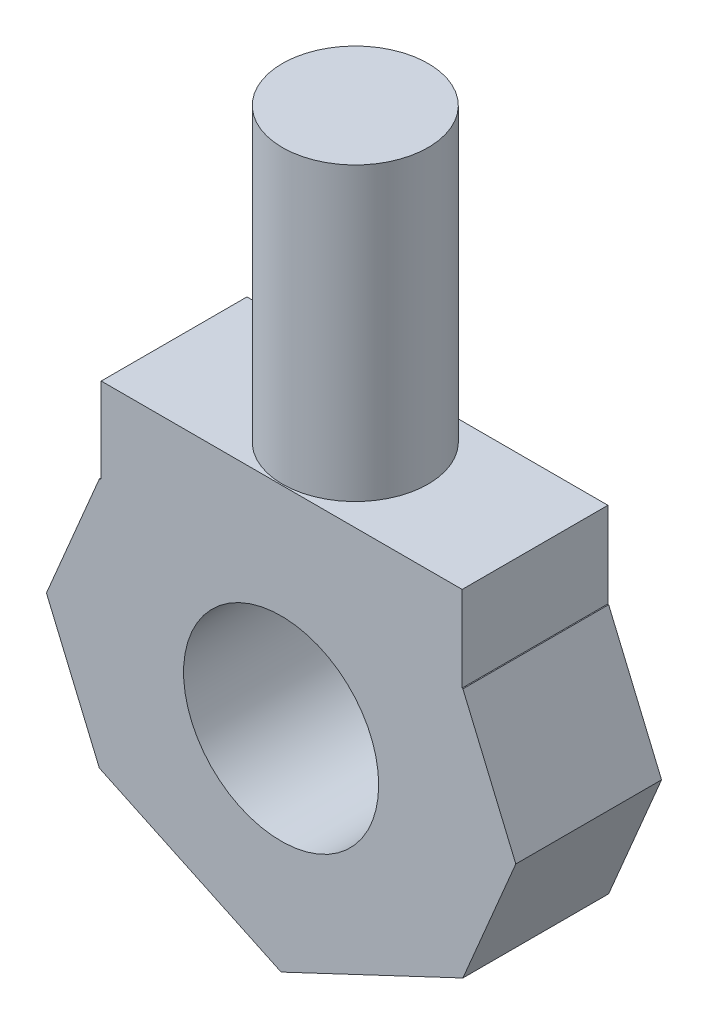
ISO-10303-21;
HEADER;
FILE_DESCRIPTION(('STEP AP214'),'2;1');
FILE_NAME('part.step','',(''),(''),'','','');
FILE_SCHEMA(('AUTOMOTIVE_DESIGN { 1 0 10303 214 1 1 1 1 }'));
ENDSEC;
DATA;
#1=APPLICATION_CONTEXT('core data for automotive mechanical design processes');
#2=APPLICATION_PROTOCOL_DEFINITION('international standard','automotive_design',2000,#1);
#3=PRODUCT_CONTEXT('',#1,'mechanical');
#4=PRODUCT('Part','Part','',(#3));
#5=PRODUCT_RELATED_PRODUCT_CATEGORY('part','',(#4));
#6=PRODUCT_DEFINITION_FORMATION('','',#4);
#7=PRODUCT_DEFINITION_CONTEXT('part definition',#1,'design');
#8=PRODUCT_DEFINITION('design','',#6,#7);
#9=PRODUCT_DEFINITION_SHAPE('','',#8);
#10=(LENGTH_UNIT() NAMED_UNIT(*) SI_UNIT(.MILLI.,.METRE.));
#11=(NAMED_UNIT(*) PLANE_ANGLE_UNIT() SI_UNIT($,.RADIAN.));
#12=(NAMED_UNIT(*) SI_UNIT($,.STERADIAN.) SOLID_ANGLE_UNIT());
#13=UNCERTAINTY_MEASURE_WITH_UNIT(LENGTH_MEASURE(1.E-05),#10,'distance_accuracy_value','');
#14=(GEOMETRIC_REPRESENTATION_CONTEXT(3) GLOBAL_UNCERTAINTY_ASSIGNED_CONTEXT((#13)) GLOBAL_UNIT_ASSIGNED_CONTEXT((#10,
#11,#12)) REPRESENTATION_CONTEXT('',''));
#15=CARTESIAN_POINT('',(0.,0.,0.));
#16=DIRECTION('',(0.,0.,1.));
#17=DIRECTION('',(1.,0.,0.));
#18=AXIS2_PLACEMENT_3D('',#15,#16,#17);
#19=CARTESIAN_POINT('',(0.,0.,10.));
#20=DIRECTION('',(0.,0.,1.));
#21=DIRECTION('',(1.,0.,0.));
#22=AXIS2_PLACEMENT_3D('',#19,#20,#21);
#23=PLANE('',#22);
#24=DIRECTION('',(-0.904410092976755,0.426664251750458,0.));
#25=VECTOR('',#24,1.);
#26=CARTESIAN_POINT('',(12.4716293470518,-5.88361236212527,10.));
#27=LINE('',#26,#25);
#28=CARTESIAN_POINT('',(12.4716293470518,-5.88361236212527,10.));
#29=VERTEX_POINT('',#28);
#30=CARTESIAN_POINT('',(12.4220102858015,-5.86020408770936,10.));
#31=VERTEX_POINT('',#30);
#32=EDGE_CURVE('E186',#29,#31,#27,.T.);
#33=ORIENTED_EDGE('',*,*,#32,.T.);
#34=DIRECTION('',(0.,1.,0.));
#35=VECTOR('',#34,1.);
#36=CARTESIAN_POINT('',(12.4220102858015,-7.,10.));
#37=LINE('',#36,#35);
#38=CARTESIAN_POINT('',(12.4220102858015,0.,10.));
#39=VERTEX_POINT('',#38);
#40=EDGE_CURVE('E172',#31,#39,#37,.T.);
#41=ORIENTED_EDGE('',*,*,#40,.T.);
#42=DIRECTION('',(1.,0.,0.));
#43=VECTOR('',#42,1.);
#44=CARTESIAN_POINT('',(-12.3435018685871,0.,10.));
#45=LINE('',#44,#43);
#46=CARTESIAN_POINT('',(-12.3435018685871,0.,10.));
#47=VERTEX_POINT('',#46);
#48=EDGE_CURVE('E160',#47,#39,#45,.T.);
#49=ORIENTED_EDGE('',*,*,#48,.F.);
#50=DIRECTION('',(0.,1.,0.));
#51=VECTOR('',#50,1.);
#52=CARTESIAN_POINT('',(-12.3435018685871,-7.,10.));
#53=LINE('',#52,#51);
#54=CARTESIAN_POINT('',(-12.3435018685871,-5.82316697882812,10.));
#55=VERTEX_POINT('',#54);
#56=EDGE_CURVE('E63',#55,#47,#53,.T.);
#57=ORIENTED_EDGE('',*,*,#56,.F.);
#58=DIRECTION('',(-0.904410092976755,-0.426664251750458,0.));
#59=VECTOR('',#58,1.);
#60=CARTESIAN_POINT('',(-12.4716293470518,-5.88361236212527,10.));
#61=LINE('',#60,#59);
#62=CARTESIAN_POINT('',(-12.4716293470518,-5.88361236212527,10.));
#63=VERTEX_POINT('',#62);
#64=EDGE_CURVE('E190',#55,#63,#61,.T.);
#65=ORIENTED_EDGE('',*,*,#64,.T.);
#66=DIRECTION('',(-0.389297249276253,-0.92111218193331,0.));
#67=VECTOR('',#66,1.);
#68=CARTESIAN_POINT('',(-12.4716293470518,-5.88361236212527,10.));
#69=LINE('',#68,#67);
#70=CARTESIAN_POINT('',(-16.1022581048738,-14.4740053924498,10.));
#71=VERTEX_POINT('',#70);
#72=EDGE_CURVE('E194',#63,#71,#69,.T.);
#73=ORIENTED_EDGE('',*,*,#72,.T.);
#74=DIRECTION('',(0.389297249276253,-0.92111218193331,0.));
#75=VECTOR('',#74,1.);
#76=CARTESIAN_POINT('',(-12.4716293470518,-23.0643984227743,10.));
#77=LINE('',#76,#75);
#78=CARTESIAN_POINT('',(-12.4716293470518,-23.0643984227743,10.));
#79=VERTEX_POINT('',#78);
#80=EDGE_CURVE('E197',#71,#79,#77,.T.);
#81=ORIENTED_EDGE('',*,*,#80,.T.);
#82=DIRECTION('',(0.904410092976755,-0.426664251750458,0.));
#83=VECTOR('',#82,1.);
#84=CARTESIAN_POINT('',(-12.4716293470518,-23.0643984227743,10.));
#85=LINE('',#84,#83);
#86=CARTESIAN_POINT('',(0.,-28.9480107848996,10.));
#87=VERTEX_POINT('',#86);
#88=EDGE_CURVE('E200',#79,#87,#85,.T.);
#89=ORIENTED_EDGE('',*,*,#88,.T.);
#90=DIRECTION('',(0.904410092976755,0.426664251750458,0.));
#91=VECTOR('',#90,1.);
#92=CARTESIAN_POINT('',(12.4716293470518,-23.0643984227743,10.));
#93=LINE('',#92,#91);
#94=CARTESIAN_POINT('',(12.4716293470518,-23.0643984227743,10.));
#95=VERTEX_POINT('',#94);
#96=EDGE_CURVE('E203',#87,#95,#93,.T.);
#97=ORIENTED_EDGE('',*,*,#96,.T.);
#98=DIRECTION('',(0.389297249276253,0.92111218193331,0.));
#99=VECTOR('',#98,1.);
#100=CARTESIAN_POINT('',(12.4716293470518,-23.0643984227743,10.));
#101=LINE('',#100,#99);
#102=CARTESIAN_POINT('',(16.1022581048738,-14.4740053924498,10.));
#103=VERTEX_POINT('',#102);
#104=EDGE_CURVE('E206',#95,#103,#101,.T.);
#105=ORIENTED_EDGE('',*,*,#104,.T.);
#106=DIRECTION('',(-0.389297249276253,0.92111218193331,0.));
#107=VECTOR('',#106,1.);
#108=CARTESIAN_POINT('',(12.4716293470518,-5.88361236212527,10.));
#109=LINE('',#108,#107);
#110=EDGE_CURVE('E209',#103,#29,#109,.T.);
#111=ORIENTED_EDGE('',*,*,#110,.T.);
#112=EDGE_LOOP('',(#33,#41,#49,#57,#65,#73,#81,#89,#97,#105,#111));
#113=FACE_BOUND('',#112,.T.);
#114=CARTESIAN_POINT('',(0.,-14.4740053924498,10.));
#115=DIRECTION('',(0.,0.,1.));
#116=DIRECTION('',(1.,0.,0.));
#117=AXIS2_PLACEMENT_3D('',#114,#115,#116);
#118=CIRCLE('',#117,6.69445656520258);
#119=CARTESIAN_POINT('',(6.69445656520258,-14.4740053924498,10.));
#120=VERTEX_POINT('',#119);
#121=EDGE_CURVE('E178',#120,#120,#118,.T.);
#122=ORIENTED_EDGE('',*,*,#121,.F.);
#123=EDGE_LOOP('',(#122));
#124=FACE_BOUND('',#123,.T.);
#125=ADVANCED_FACE('F39',(#113,#124),#23,.T.);
#126=CARTESIAN_POINT('',(0.,0.,0.));
#127=DIRECTION('',(0.,0.,1.));
#128=DIRECTION('',(1.,0.,0.));
#129=AXIS2_PLACEMENT_3D('',#126,#127,#128);
#130=PLANE('',#129);
#131=DIRECTION('',(0.,1.,0.));
#132=VECTOR('',#131,1.);
#133=CARTESIAN_POINT('',(12.4220102858015,-7.,0.));
#134=LINE('',#133,#132);
#135=CARTESIAN_POINT('',(12.4220102858015,-5.86020408770936,0.));
#136=VERTEX_POINT('',#135);
#137=CARTESIAN_POINT('',(12.4220102858015,0.,0.));
#138=VERTEX_POINT('',#137);
#139=EDGE_CURVE('E169',#136,#138,#134,.T.);
#140=ORIENTED_EDGE('',*,*,#139,.F.);
#141=DIRECTION('',(-0.904410092976755,0.426664251750458,0.));
#142=VECTOR('',#141,1.);
#143=CARTESIAN_POINT('',(12.4716293470518,-5.88361236212527,0.));
#144=LINE('',#143,#142);
#145=CARTESIAN_POINT('',(12.4716293470518,-5.88361236212527,0.));
#146=VERTEX_POINT('',#145);
#147=EDGE_CURVE('E182',#146,#136,#144,.T.);
#148=ORIENTED_EDGE('',*,*,#147,.F.);
#149=DIRECTION('',(-0.389297249276253,0.92111218193331,0.));
#150=VECTOR('',#149,1.);
#151=CARTESIAN_POINT('',(12.4716293470518,-5.88361236212527,0.));
#152=LINE('',#151,#150);
#153=CARTESIAN_POINT('',(16.1022581048738,-14.4740053924498,0.));
#154=VERTEX_POINT('',#153);
#155=EDGE_CURVE('E191',#154,#146,#152,.T.);
#156=ORIENTED_EDGE('',*,*,#155,.F.);
#157=DIRECTION('',(0.389297249276253,0.92111218193331,0.));
#158=VECTOR('',#157,1.);
#159=CARTESIAN_POINT('',(12.4716293470518,-23.0643984227743,0.));
#160=LINE('',#159,#158);
#161=CARTESIAN_POINT('',(12.4716293470518,-23.0643984227743,0.));
#162=VERTEX_POINT('',#161);
#163=EDGE_CURVE('E231',#162,#154,#160,.T.);
#164=ORIENTED_EDGE('',*,*,#163,.F.);
#165=DIRECTION('',(0.904410092976755,0.426664251750458,0.));
#166=VECTOR('',#165,1.);
#167=CARTESIAN_POINT('',(12.4716293470518,-23.0643984227743,0.));
#168=LINE('',#167,#166);
#169=CARTESIAN_POINT('',(0.,-28.9480107848996,0.));
#170=VERTEX_POINT('',#169);
#171=EDGE_CURVE('E228',#170,#162,#168,.T.);
#172=ORIENTED_EDGE('',*,*,#171,.F.);
#173=DIRECTION('',(0.904410092976755,-0.426664251750458,0.));
#174=VECTOR('',#173,1.);
#175=CARTESIAN_POINT('',(-12.4716293470518,-23.0643984227743,0.));
#176=LINE('',#175,#174);
#177=CARTESIAN_POINT('',(-12.4716293470518,-23.0643984227743,0.));
#178=VERTEX_POINT('',#177);
#179=EDGE_CURVE('E225',#178,#170,#176,.T.);
#180=ORIENTED_EDGE('',*,*,#179,.F.);
#181=DIRECTION('',(0.389297249276253,-0.92111218193331,0.));
#182=VECTOR('',#181,1.);
#183=CARTESIAN_POINT('',(-12.4716293470518,-23.0643984227743,0.));
#184=LINE('',#183,#182);
#185=CARTESIAN_POINT('',(-16.1022581048738,-14.4740053924498,0.));
#186=VERTEX_POINT('',#185);
#187=EDGE_CURVE('E222',#186,#178,#184,.T.);
#188=ORIENTED_EDGE('',*,*,#187,.F.);
#189=DIRECTION('',(-0.389297249276253,-0.92111218193331,0.));
#190=VECTOR('',#189,1.);
#191=CARTESIAN_POINT('',(-12.4716293470518,-5.88361236212527,0.));
#192=LINE('',#191,#190);
#193=CARTESIAN_POINT('',(-12.4716293470518,-5.88361236212527,0.));
#194=VERTEX_POINT('',#193);
#195=EDGE_CURVE('E219',#194,#186,#192,.T.);
#196=ORIENTED_EDGE('',*,*,#195,.F.);
#197=DIRECTION('',(-0.904410092976755,-0.426664251750458,0.));
#198=VECTOR('',#197,1.);
#199=CARTESIAN_POINT('',(-12.4716293470518,-5.88361236212527,0.));
#200=LINE('',#199,#198);
#201=CARTESIAN_POINT('',(-12.3435018685871,-5.82316697882812,0.));
#202=VERTEX_POINT('',#201);
#203=EDGE_CURVE('E216',#202,#194,#200,.T.);
#204=ORIENTED_EDGE('',*,*,#203,.F.);
#205=DIRECTION('',(0.,1.,0.));
#206=VECTOR('',#205,1.);
#207=CARTESIAN_POINT('',(-12.3435018685871,-7.,0.));
#208=LINE('',#207,#206);
#209=CARTESIAN_POINT('',(-12.3435018685871,0.,0.));
#210=VERTEX_POINT('',#209);
#211=EDGE_CURVE('E165',#202,#210,#208,.T.);
#212=ORIENTED_EDGE('',*,*,#211,.T.);
#213=DIRECTION('',(-1.,0.,0.));
#214=VECTOR('',#213,1.);
#215=CARTESIAN_POINT('',(-12.3435018685871,0.,0.));
#216=LINE('',#215,#214);
#217=CARTESIAN_POINT('',(-0.930466410144817,0.,0.));
#218=VERTEX_POINT('',#217);
#219=EDGE_CURVE('E138',#218,#210,#216,.T.);
#220=ORIENTED_EDGE('',*,*,#219,.F.);
#221=CARTESIAN_POINT('',(0.930466410144817,0.,0.));
#222=VERTEX_POINT('',#221);
#223=EDGE_CURVE('E136',#222,#218,#216,.T.);
#224=ORIENTED_EDGE('',*,*,#223,.F.);
#225=EDGE_CURVE('E127',#138,#222,#216,.T.);
#226=ORIENTED_EDGE('',*,*,#225,.F.);
#227=EDGE_LOOP('',(#140,#148,#156,#164,#172,#180,#188,#196,#204,#212,#220,#224,#226));
#228=FACE_BOUND('',#227,.T.);
#229=CARTESIAN_POINT('',(0.,-14.4740053924498,0.));
#230=DIRECTION('',(0.,0.,1.));
#231=DIRECTION('',(1.,0.,0.));
#232=AXIS2_PLACEMENT_3D('',#229,#230,#231);
#233=CIRCLE('',#232,6.69445656520258);
#234=CARTESIAN_POINT('',(6.69445656520258,-14.4740053924498,0.));
#235=VERTEX_POINT('',#234);
#236=EDGE_CURVE('E168',#235,#235,#233,.T.);
#237=ORIENTED_EDGE('',*,*,#236,.T.);
#238=EDGE_LOOP('',(#237));
#239=FACE_BOUND('',#238,.T.);
#240=ADVANCED_FACE('F140',(#228,#239),#130,.F.);
#241=CARTESIAN_POINT('',(12.4716293470518,-5.88361236212527,10.));
#242=DIRECTION('',(-0.426664251750458,-0.904410092976755,0.));
#243=DIRECTION('',(0.904410092976755,-0.426664251750458,0.));
#244=AXIS2_PLACEMENT_3D('',#241,#242,#243);
#245=PLANE('',#244);
#246=ORIENTED_EDGE('',*,*,#147,.T.);
#247=DIRECTION('',(0.,0.,1.));
#248=VECTOR('',#247,1.);
#249=CARTESIAN_POINT('',(12.4220102858015,-5.86020408770936,10.));
#250=LINE('',#249,#248);
#251=EDGE_CURVE('E43',#136,#31,#250,.T.);
#252=ORIENTED_EDGE('',*,*,#251,.T.);
#253=ORIENTED_EDGE('',*,*,#32,.F.);
#254=DIRECTION('',(0.,0.,-1.));
#255=VECTOR('',#254,1.);
#256=CARTESIAN_POINT('',(12.4716293470518,-5.88361236212527,10.));
#257=LINE('',#256,#255);
#258=EDGE_CURVE('E212',#29,#146,#257,.T.);
#259=ORIENTED_EDGE('',*,*,#258,.T.);
#260=EDGE_LOOP('',(#246,#252,#253,#259));
#261=FACE_BOUND('',#260,.T.);
#262=ADVANCED_FACE('F41',(#261),#245,.F.);
#263=CARTESIAN_POINT('',(-12.4716293470518,-5.88361236212527,10.));
#264=DIRECTION('',(0.426664251750458,-0.904410092976755,0.));
#265=DIRECTION('',(0.904410092976755,0.426664251750458,0.));
#266=AXIS2_PLACEMENT_3D('',#263,#264,#265);
#267=PLANE('',#266);
#268=ORIENTED_EDGE('',*,*,#64,.F.);
#269=DIRECTION('',(0.,0.,-1.));
#270=VECTOR('',#269,1.);
#271=CARTESIAN_POINT('',(-12.3435018685871,-5.82316697882812,10.));
#272=LINE('',#271,#270);
#273=EDGE_CURVE('E262',#55,#202,#272,.T.);
#274=ORIENTED_EDGE('',*,*,#273,.T.);
#275=ORIENTED_EDGE('',*,*,#203,.T.);
#276=DIRECTION('',(0.,0.,-1.));
#277=VECTOR('',#276,1.);
#278=CARTESIAN_POINT('',(-12.4716293470518,-5.88361236212527,10.));
#279=LINE('',#278,#277);
#280=EDGE_CURVE('E259',#63,#194,#279,.T.);
#281=ORIENTED_EDGE('',*,*,#280,.F.);
#282=EDGE_LOOP('',(#268,#274,#275,#281));
#283=FACE_BOUND('',#282,.T.);
#284=ADVANCED_FACE('F324',(#283),#267,.F.);
#285=CARTESIAN_POINT('',(-12.4716293470518,-5.88361236212527,10.));
#286=DIRECTION('',(0.92111218193331,-0.389297249276253,0.));
#287=DIRECTION('',(0.389297249276253,0.92111218193331,0.));
#288=AXIS2_PLACEMENT_3D('',#285,#286,#287);
#289=PLANE('',#288);
#290=ORIENTED_EDGE('',*,*,#195,.T.);
#291=DIRECTION('',(0.,0.,-1.));
#292=VECTOR('',#291,1.);
#293=CARTESIAN_POINT('',(-16.1022581048738,-14.4740053924498,10.));
#294=LINE('',#293,#292);
#295=EDGE_CURVE('E255',#71,#186,#294,.T.);
#296=ORIENTED_EDGE('',*,*,#295,.F.);
#297=ORIENTED_EDGE('',*,*,#72,.F.);
#298=ORIENTED_EDGE('',*,*,#280,.T.);
#299=EDGE_LOOP('',(#290,#296,#297,#298));
#300=FACE_BOUND('',#299,.T.);
#301=ADVANCED_FACE('F321',(#300),#289,.F.);
#302=CARTESIAN_POINT('',(-12.4716293470518,-23.0643984227743,10.));
#303=DIRECTION('',(0.92111218193331,0.389297249276253,0.));
#304=DIRECTION('',(-0.389297249276253,0.92111218193331,0.));
#305=AXIS2_PLACEMENT_3D('',#302,#303,#304);
#306=PLANE('',#305);
#307=ORIENTED_EDGE('',*,*,#187,.T.);
#308=DIRECTION('',(0.,0.,-1.));
#309=VECTOR('',#308,1.);
#310=CARTESIAN_POINT('',(-12.4716293470518,-23.0643984227743,10.));
#311=LINE('',#310,#309);
#312=EDGE_CURVE('E251',#79,#178,#311,.T.);
#313=ORIENTED_EDGE('',*,*,#312,.F.);
#314=ORIENTED_EDGE('',*,*,#80,.F.);
#315=ORIENTED_EDGE('',*,*,#295,.T.);
#316=EDGE_LOOP('',(#307,#313,#314,#315));
#317=FACE_BOUND('',#316,.T.);
#318=ADVANCED_FACE('F317',(#317),#306,.F.);
#319=CARTESIAN_POINT('',(-12.4716293470518,-23.0643984227743,10.));
#320=DIRECTION('',(0.426664251750458,0.904410092976755,0.));
#321=DIRECTION('',(-0.904410092976755,0.426664251750458,0.));
#322=AXIS2_PLACEMENT_3D('',#319,#320,#321);
#323=PLANE('',#322);
#324=ORIENTED_EDGE('',*,*,#179,.T.);
#325=DIRECTION('',(0.,0.,-1.));
#326=VECTOR('',#325,1.);
#327=CARTESIAN_POINT('',(0.,-28.9480107848996,10.));
#328=LINE('',#327,#326);
#329=EDGE_CURVE('E247',#87,#170,#328,.T.);
#330=ORIENTED_EDGE('',*,*,#329,.F.);
#331=ORIENTED_EDGE('',*,*,#88,.F.);
#332=ORIENTED_EDGE('',*,*,#312,.T.);
#333=EDGE_LOOP('',(#324,#330,#331,#332));
#334=FACE_BOUND('',#333,.T.);
#335=ADVANCED_FACE('F313',(#334),#323,.F.);
#336=CARTESIAN_POINT('',(12.4716293470518,-23.0643984227743,10.));
#337=DIRECTION('',(-0.426664251750458,0.904410092976755,0.));
#338=DIRECTION('',(-0.904410092976755,-0.426664251750458,0.));
#339=AXIS2_PLACEMENT_3D('',#336,#337,#338);
#340=PLANE('',#339);
#341=ORIENTED_EDGE('',*,*,#171,.T.);
#342=DIRECTION('',(0.,0.,-1.));
#343=VECTOR('',#342,1.);
#344=CARTESIAN_POINT('',(12.4716293470518,-23.0643984227743,10.));
#345=LINE('',#344,#343);
#346=EDGE_CURVE('E243',#95,#162,#345,.T.);
#347=ORIENTED_EDGE('',*,*,#346,.F.);
#348=ORIENTED_EDGE('',*,*,#96,.F.);
#349=ORIENTED_EDGE('',*,*,#329,.T.);
#350=EDGE_LOOP('',(#341,#347,#348,#349));
#351=FACE_BOUND('',#350,.T.);
#352=ADVANCED_FACE('F309',(#351),#340,.F.);
#353=CARTESIAN_POINT('',(12.4716293470518,-23.0643984227743,10.));
#354=DIRECTION('',(-0.92111218193331,0.389297249276253,0.));
#355=DIRECTION('',(-0.389297249276253,-0.92111218193331,0.));
#356=AXIS2_PLACEMENT_3D('',#353,#354,#355);
#357=PLANE('',#356);
#358=ORIENTED_EDGE('',*,*,#163,.T.);
#359=DIRECTION('',(0.,0.,-1.));
#360=VECTOR('',#359,1.);
#361=CARTESIAN_POINT('',(16.1022581048738,-14.4740053924498,10.));
#362=LINE('',#361,#360);
#363=EDGE_CURVE('E239',#103,#154,#362,.T.);
#364=ORIENTED_EDGE('',*,*,#363,.F.);
#365=ORIENTED_EDGE('',*,*,#104,.F.);
#366=ORIENTED_EDGE('',*,*,#346,.T.);
#367=EDGE_LOOP('',(#358,#364,#365,#366));
#368=FACE_BOUND('',#367,.T.);
#369=ADVANCED_FACE('F306',(#368),#357,.F.);
#370=CARTESIAN_POINT('',(12.4716293470518,-5.88361236212527,10.));
#371=DIRECTION('',(-0.92111218193331,-0.389297249276253,0.));
#372=DIRECTION('',(0.389297249276253,-0.92111218193331,0.));
#373=AXIS2_PLACEMENT_3D('',#370,#371,#372);
#374=PLANE('',#373);
#375=ORIENTED_EDGE('',*,*,#155,.T.);
#376=ORIENTED_EDGE('',*,*,#258,.F.);
#377=ORIENTED_EDGE('',*,*,#110,.F.);
#378=ORIENTED_EDGE('',*,*,#363,.T.);
#379=EDGE_LOOP('',(#375,#376,#377,#378));
#380=FACE_BOUND('',#379,.T.);
#381=ADVANCED_FACE('F280',(#380),#374,.F.);
#382=CARTESIAN_POINT('',(0.,-14.4740053924498,10.));
#383=DIRECTION('',(0.,0.,-1.));
#384=DIRECTION('',(-1.,0.,0.));
#385=AXIS2_PLACEMENT_3D('',#382,#383,#384);
#386=CYLINDRICAL_SURFACE('',#385,6.69445656520258);
#387=ORIENTED_EDGE('',*,*,#121,.T.);
#388=EDGE_LOOP('',(#387));
#389=FACE_BOUND('',#388,.T.);
#390=ORIENTED_EDGE('',*,*,#236,.F.);
#391=EDGE_LOOP('',(#390));
#392=FACE_BOUND('',#391,.T.);
#393=ADVANCED_FACE('F286',(#389,#392),#386,.F.);
#394=CARTESIAN_POINT('',(12.4220102858015,-7.,0.));
#395=DIRECTION('',(1.,0.,0.));
#396=DIRECTION('',(0.,0.,-1.));
#397=AXIS2_PLACEMENT_3D('',#394,#395,#396);
#398=PLANE('',#397);
#399=ORIENTED_EDGE('',*,*,#251,.F.);
#400=ORIENTED_EDGE('',*,*,#139,.T.);
#401=DIRECTION('',(0.,0.,-1.));
#402=VECTOR('',#401,1.);
#403=CARTESIAN_POINT('',(12.4220102858015,0.,0.));
#404=LINE('',#403,#402);
#405=EDGE_CURVE('E131',#39,#138,#404,.T.);
#406=ORIENTED_EDGE('',*,*,#405,.F.);
#407=ORIENTED_EDGE('',*,*,#40,.F.);
#408=EDGE_LOOP('',(#399,#400,#406,#407));
#409=FACE_BOUND('',#408,.T.);
#410=ADVANCED_FACE('F283',(#409),#398,.T.);
#411=CARTESIAN_POINT('',(-12.3435018685871,-7.,0.));
#412=DIRECTION('',(-1.,0.,0.));
#413=DIRECTION('',(0.,0.,1.));
#414=AXIS2_PLACEMENT_3D('',#411,#412,#413);
#415=PLANE('',#414);
#416=ORIENTED_EDGE('',*,*,#273,.F.);
#417=ORIENTED_EDGE('',*,*,#56,.T.);
#418=DIRECTION('',(0.,0.,1.));
#419=VECTOR('',#418,1.);
#420=CARTESIAN_POINT('',(-12.3435018685871,0.,0.));
#421=LINE('',#420,#419);
#422=EDGE_CURVE('E154',#210,#47,#421,.T.);
#423=ORIENTED_EDGE('',*,*,#422,.F.);
#424=ORIENTED_EDGE('',*,*,#211,.F.);
#425=EDGE_LOOP('',(#416,#417,#423,#424));
#426=FACE_BOUND('',#425,.T.);
#427=ADVANCED_FACE('F285',(#426),#415,.T.);
#428=CARTESIAN_POINT('',(0.,0.,0.));
#429=DIRECTION('',(0.,1.,0.));
#430=DIRECTION('',(0.,0.,1.));
#431=AXIS2_PLACEMENT_3D('',#428,#429,#430);
#432=PLANE('',#431);
#433=CARTESIAN_POINT('',(0.,0.,4.91266040548217));
#434=DIRECTION('',(0.,1.,0.));
#435=DIRECTION('',(0.,0.,1.));
#436=AXIS2_PLACEMENT_3D('',#433,#434,#435);
#437=CIRCLE('',#436,5.);
#438=EDGE_CURVE('E11',#218,#222,#437,.T.);
#439=ORIENTED_EDGE('',*,*,#438,.F.);
#440=ORIENTED_EDGE('',*,*,#219,.T.);
#441=ORIENTED_EDGE('',*,*,#422,.T.);
#442=ORIENTED_EDGE('',*,*,#48,.T.);
#443=ORIENTED_EDGE('',*,*,#405,.T.);
#444=ORIENTED_EDGE('',*,*,#225,.T.);
#445=EDGE_LOOP('',(#439,#440,#441,#442,#443,#444));
#446=FACE_BOUND('',#445,.T.);
#447=ADVANCED_FACE('F129',(#446),#432,.T.);
#448=CARTESIAN_POINT('',(0.,0.,4.91266040548217));
#449=DIRECTION('',(0.,1.,0.));
#450=DIRECTION('',(0.,0.,1.));
#451=AXIS2_PLACEMENT_3D('',#448,#449,#450);
#452=PLANE('',#451);
#453=EDGE_CURVE('E50',#222,#218,#437,.T.);
#454=ORIENTED_EDGE('',*,*,#453,.F.);
#455=ORIENTED_EDGE('',*,*,#223,.T.);
#456=EDGE_LOOP('',(#454,#455));
#457=FACE_BOUND('',#456,.T.);
#458=ADVANCED_FACE('F149',(#457),#452,.F.);
#459=CARTESIAN_POINT('',(0.,20.,4.91266040548217));
#460=DIRECTION('',(0.,-1.,0.));
#461=DIRECTION('',(0.,0.,-1.));
#462=AXIS2_PLACEMENT_3D('',#459,#460,#461);
#463=CYLINDRICAL_SURFACE('',#462,5.);
#464=CARTESIAN_POINT('',(0.,20.,4.91266040548217));
#465=DIRECTION('',(0.,1.,0.));
#466=DIRECTION('',(0.,0.,1.));
#467=AXIS2_PLACEMENT_3D('',#464,#465,#466);
#468=CIRCLE('',#467,5.);
#469=CARTESIAN_POINT('',(0.,20.,9.91266040548217));
#470=VERTEX_POINT('',#469);
#471=EDGE_CURVE('E151',#470,#470,#468,.T.);
#472=ORIENTED_EDGE('',*,*,#471,.F.);
#473=EDGE_LOOP('',(#472));
#474=FACE_BOUND('',#473,.T.);
#475=ORIENTED_EDGE('',*,*,#453,.T.);
#476=ORIENTED_EDGE('',*,*,#438,.T.);
#477=EDGE_LOOP('',(#475,#476));
#478=FACE_BOUND('',#477,.T.);
#479=ADVANCED_FACE('F148',(#474,#478),#463,.T.);
#480=CARTESIAN_POINT('',(0.,20.,4.91266040548217));
#481=DIRECTION('',(0.,1.,0.));
#482=DIRECTION('',(0.,0.,1.));
#483=AXIS2_PLACEMENT_3D('',#480,#481,#482);
#484=PLANE('',#483);
#485=ORIENTED_EDGE('',*,*,#471,.T.);
#486=EDGE_LOOP('',(#485));
#487=FACE_BOUND('',#486,.T.);
#488=ADVANCED_FACE('F381',(#487),#484,.T.);
#489=CLOSED_SHELL('',(#125,#240,#262,#284,#301,#318,#335,#352,#369,#381,#393,#410,#427,#447,
#458,#479,#488));
#490=MANIFOLD_SOLID_BREP('B2',#489);
#491=ADVANCED_BREP_SHAPE_REPRESENTATION('',(#18,#490),#14);
#492=SHAPE_DEFINITION_REPRESENTATION(#9,#491);
ENDSEC;
END-ISO-10303-21;
